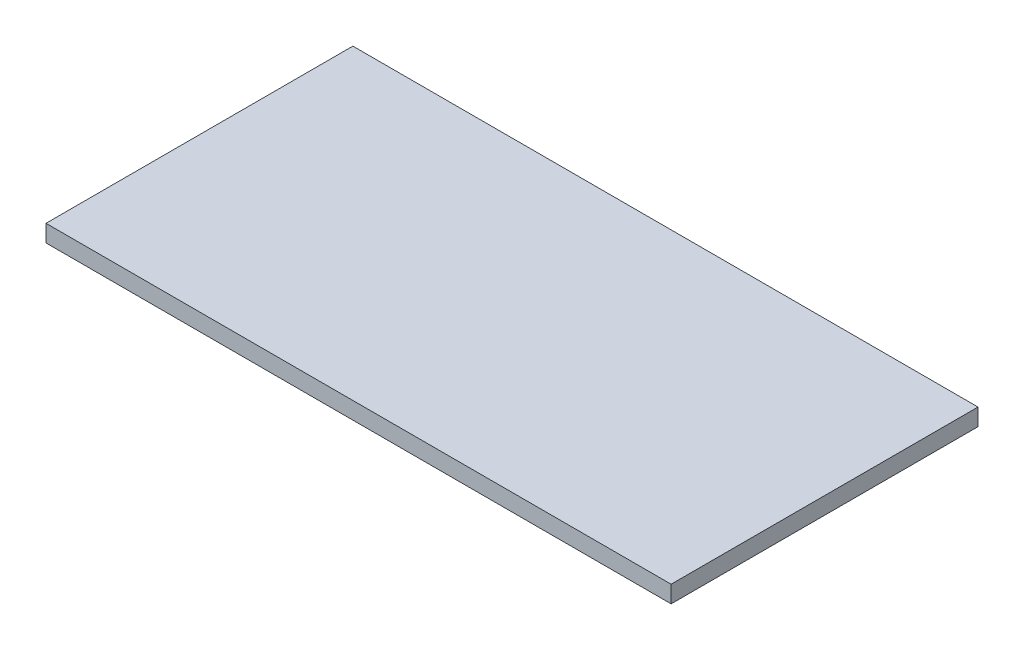
ISO-10303-21;
HEADER;
FILE_DESCRIPTION(('STEP AP214'),'2;1');
FILE_NAME('part.step','',(''),(''),'','','');
FILE_SCHEMA(('AUTOMOTIVE_DESIGN { 1 0 10303 214 1 1 1 1 }'));
ENDSEC;
DATA;
#1=APPLICATION_CONTEXT('core data for automotive mechanical design processes');
#2=APPLICATION_PROTOCOL_DEFINITION('international standard','automotive_design',2000,#1);
#3=PRODUCT_CONTEXT('',#1,'mechanical');
#4=PRODUCT('Part','Part','',(#3));
#5=PRODUCT_RELATED_PRODUCT_CATEGORY('part','',(#4));
#6=PRODUCT_DEFINITION_FORMATION('','',#4);
#7=PRODUCT_DEFINITION_CONTEXT('part definition',#1,'design');
#8=PRODUCT_DEFINITION('design','',#6,#7);
#9=PRODUCT_DEFINITION_SHAPE('','',#8);
#10=(LENGTH_UNIT() NAMED_UNIT(*) SI_UNIT(.MILLI.,.METRE.));
#11=(NAMED_UNIT(*) PLANE_ANGLE_UNIT() SI_UNIT($,.RADIAN.));
#12=(NAMED_UNIT(*) SI_UNIT($,.STERADIAN.) SOLID_ANGLE_UNIT());
#13=UNCERTAINTY_MEASURE_WITH_UNIT(LENGTH_MEASURE(1.E-05),#10,'distance_accuracy_value','');
#14=(GEOMETRIC_REPRESENTATION_CONTEXT(3) GLOBAL_UNCERTAINTY_ASSIGNED_CONTEXT((#13)) GLOBAL_UNIT_ASSIGNED_CONTEXT((#10,
#11,#12)) REPRESENTATION_CONTEXT('',''));
#15=CARTESIAN_POINT('',(0.,0.,0.));
#16=DIRECTION('',(0.,0.,1.));
#17=DIRECTION('',(1.,0.,0.));
#18=AXIS2_PLACEMENT_3D('',#15,#16,#17);
#19=CARTESIAN_POINT('',(-54.,3.,-35.0217391304348));
#20=DIRECTION('',(1.,0.,0.));
#21=DIRECTION('',(0.,0.,-1.));
#22=AXIS2_PLACEMENT_3D('',#19,#20,#21);
#23=PLANE('',#22);
#24=DIRECTION('',(0.,0.,1.));
#25=VECTOR('',#24,1.);
#26=CARTESIAN_POINT('',(-54.,0.,-35.0217391304348));
#27=LINE('',#26,#25);
#28=CARTESIAN_POINT('',(-54.,0.,-35.0217391304348));
#29=VERTEX_POINT('',#28);
#30=CARTESIAN_POINT('',(-54.,0.,18.9782608695652));
#31=VERTEX_POINT('',#30);
#32=EDGE_CURVE('E107',#29,#31,#27,.T.);
#33=ORIENTED_EDGE('',*,*,#32,.T.);
#34=DIRECTION('',(0.,-1.,0.));
#35=VECTOR('',#34,1.);
#36=CARTESIAN_POINT('',(-54.,3.,18.9782608695652));
#37=LINE('',#36,#35);
#38=CARTESIAN_POINT('',(-54.,3.,18.9782608695652));
#39=VERTEX_POINT('',#38);
#40=EDGE_CURVE('E11',#39,#31,#37,.T.);
#41=ORIENTED_EDGE('',*,*,#40,.F.);
#42=DIRECTION('',(0.,0.,1.));
#43=VECTOR('',#42,1.);
#44=CARTESIAN_POINT('',(-54.,3.,-35.0217391304348));
#45=LINE('',#44,#43);
#46=CARTESIAN_POINT('',(-54.,3.,-35.0217391304348));
#47=VERTEX_POINT('',#46);
#48=EDGE_CURVE('E91',#47,#39,#45,.T.);
#49=ORIENTED_EDGE('',*,*,#48,.F.);
#50=DIRECTION('',(0.,-1.,0.));
#51=VECTOR('',#50,1.);
#52=CARTESIAN_POINT('',(-54.,3.,-35.0217391304348));
#53=LINE('',#52,#51);
#54=EDGE_CURVE('E103',#47,#29,#53,.T.);
#55=ORIENTED_EDGE('',*,*,#54,.T.);
#56=EDGE_LOOP('',(#33,#41,#49,#55));
#57=FACE_BOUND('',#56,.T.);
#58=ADVANCED_FACE('F39',(#57),#23,.F.);
#59=CARTESIAN_POINT('',(-54.,3.,18.9782608695652));
#60=DIRECTION('',(0.,0.,-1.));
#61=DIRECTION('',(-1.,0.,0.));
#62=AXIS2_PLACEMENT_3D('',#59,#60,#61);
#63=PLANE('',#62);
#64=DIRECTION('',(1.,0.,0.));
#65=VECTOR('',#64,1.);
#66=CARTESIAN_POINT('',(-54.,0.,18.9782608695652));
#67=LINE('',#66,#65);
#68=CARTESIAN_POINT('',(56.,0.,18.9782608695652));
#69=VERTEX_POINT('',#68);
#70=EDGE_CURVE('E96',#31,#69,#67,.T.);
#71=ORIENTED_EDGE('',*,*,#70,.T.);
#72=DIRECTION('',(0.,-1.,0.));
#73=VECTOR('',#72,1.);
#74=CARTESIAN_POINT('',(56.,3.,18.9782608695652));
#75=LINE('',#74,#73);
#76=CARTESIAN_POINT('',(56.,3.,18.9782608695652));
#77=VERTEX_POINT('',#76);
#78=EDGE_CURVE('E48',#77,#69,#75,.T.);
#79=ORIENTED_EDGE('',*,*,#78,.F.);
#80=DIRECTION('',(1.,0.,0.));
#81=VECTOR('',#80,1.);
#82=CARTESIAN_POINT('',(-54.,3.,18.9782608695652));
#83=LINE('',#82,#81);
#84=EDGE_CURVE('E86',#39,#77,#83,.T.);
#85=ORIENTED_EDGE('',*,*,#84,.F.);
#86=ORIENTED_EDGE('',*,*,#40,.T.);
#87=EDGE_LOOP('',(#71,#79,#85,#86));
#88=FACE_BOUND('',#87,.T.);
#89=ADVANCED_FACE('F95',(#88),#63,.F.);
#90=CARTESIAN_POINT('',(56.,3.,-35.0217391304348));
#91=DIRECTION('',(-1.,0.,0.));
#92=DIRECTION('',(0.,0.,1.));
#93=AXIS2_PLACEMENT_3D('',#90,#91,#92);
#94=PLANE('',#93);
#95=DIRECTION('',(0.,0.,-1.));
#96=VECTOR('',#95,1.);
#97=CARTESIAN_POINT('',(56.,0.,-35.0217391304348));
#98=LINE('',#97,#96);
#99=CARTESIAN_POINT('',(56.,0.,-35.0217391304348));
#100=VERTEX_POINT('',#99);
#101=EDGE_CURVE('E73',#69,#100,#98,.T.);
#102=ORIENTED_EDGE('',*,*,#101,.T.);
#103=DIRECTION('',(0.,-1.,0.));
#104=VECTOR('',#103,1.);
#105=CARTESIAN_POINT('',(56.,3.,-35.0217391304348));
#106=LINE('',#105,#104);
#107=CARTESIAN_POINT('',(56.,3.,-35.0217391304348));
#108=VERTEX_POINT('',#107);
#109=EDGE_CURVE('E98',#108,#100,#106,.T.);
#110=ORIENTED_EDGE('',*,*,#109,.F.);
#111=DIRECTION('',(0.,0.,-1.));
#112=VECTOR('',#111,1.);
#113=CARTESIAN_POINT('',(56.,3.,-35.0217391304348));
#114=LINE('',#113,#112);
#115=EDGE_CURVE('E89',#77,#108,#114,.T.);
#116=ORIENTED_EDGE('',*,*,#115,.F.);
#117=ORIENTED_EDGE('',*,*,#78,.T.);
#118=EDGE_LOOP('',(#102,#110,#116,#117));
#119=FACE_BOUND('',#118,.T.);
#120=ADVANCED_FACE('F99',(#119),#94,.F.);
#121=CARTESIAN_POINT('',(-54.,3.,-35.0217391304348));
#122=DIRECTION('',(0.,0.,1.));
#123=DIRECTION('',(1.,0.,0.));
#124=AXIS2_PLACEMENT_3D('',#121,#122,#123);
#125=PLANE('',#124);
#126=DIRECTION('',(-1.,0.,0.));
#127=VECTOR('',#126,1.);
#128=CARTESIAN_POINT('',(-54.,0.,-35.0217391304348));
#129=LINE('',#128,#127);
#130=EDGE_CURVE('E79',#100,#29,#129,.T.);
#131=ORIENTED_EDGE('',*,*,#130,.T.);
#132=ORIENTED_EDGE('',*,*,#54,.F.);
#133=DIRECTION('',(-1.,0.,0.));
#134=VECTOR('',#133,1.);
#135=CARTESIAN_POINT('',(-54.,3.,-35.0217391304348));
#136=LINE('',#135,#134);
#137=EDGE_CURVE('E56',#108,#47,#136,.T.);
#138=ORIENTED_EDGE('',*,*,#137,.F.);
#139=ORIENTED_EDGE('',*,*,#109,.T.);
#140=EDGE_LOOP('',(#131,#132,#138,#139));
#141=FACE_BOUND('',#140,.T.);
#142=ADVANCED_FACE('F120',(#141),#125,.F.);
#143=CARTESIAN_POINT('',(0.,3.,0.));
#144=DIRECTION('',(0.,1.,0.));
#145=DIRECTION('',(0.,0.,1.));
#146=AXIS2_PLACEMENT_3D('',#143,#144,#145);
#147=PLANE('',#146);
#148=ORIENTED_EDGE('',*,*,#48,.T.);
#149=ORIENTED_EDGE('',*,*,#84,.T.);
#150=ORIENTED_EDGE('',*,*,#115,.T.);
#151=ORIENTED_EDGE('',*,*,#137,.T.);
#152=EDGE_LOOP('',(#148,#149,#150,#151));
#153=FACE_BOUND('',#152,.T.);
#154=ADVANCED_FACE('F87',(#153),#147,.T.);
#155=CARTESIAN_POINT('',(0.,0.,0.));
#156=DIRECTION('',(0.,1.,0.));
#157=DIRECTION('',(0.,0.,1.));
#158=AXIS2_PLACEMENT_3D('',#155,#156,#157);
#159=PLANE('',#158);
#160=ORIENTED_EDGE('',*,*,#32,.F.);
#161=ORIENTED_EDGE('',*,*,#130,.F.);
#162=ORIENTED_EDGE('',*,*,#101,.F.);
#163=ORIENTED_EDGE('',*,*,#70,.F.);
#164=EDGE_LOOP('',(#160,#161,#162,#163));
#165=FACE_BOUND('',#164,.T.);
#166=ADVANCED_FACE('F123',(#165),#159,.F.);
#167=CLOSED_SHELL('',(#58,#89,#120,#142,#154,#166));
#168=MANIFOLD_SOLID_BREP('B2',#167);
#169=ADVANCED_BREP_SHAPE_REPRESENTATION('',(#18,#168),#14);
#170=SHAPE_DEFINITION_REPRESENTATION(#9,#169);
ENDSEC;
END-ISO-10303-21;
